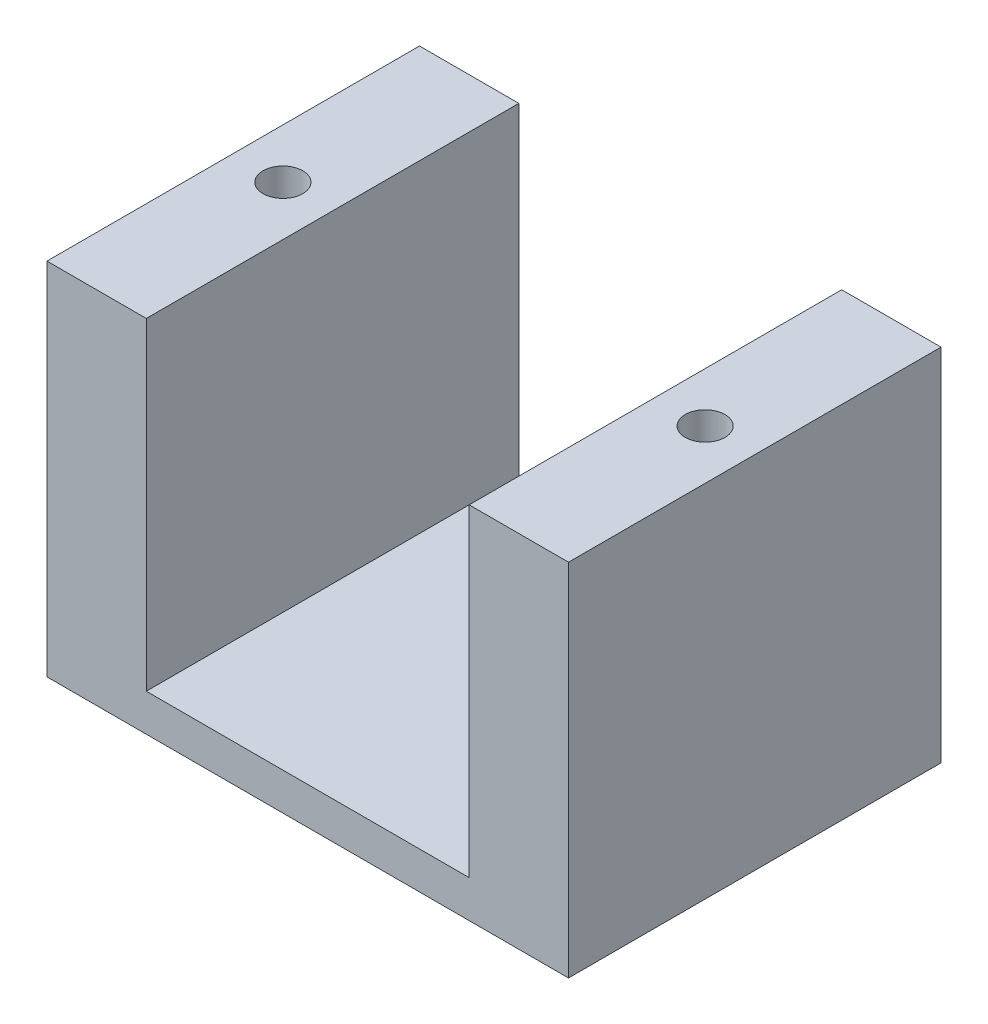
ISO-10303-21;
HEADER;
FILE_DESCRIPTION(('STEP AP214'),'2;1');
FILE_NAME('part.step','',(''),(''),'','','');
FILE_SCHEMA(('AUTOMOTIVE_DESIGN { 1 0 10303 214 1 1 1 1 }'));
ENDSEC;
DATA;
#1=APPLICATION_CONTEXT('core data for automotive mechanical design processes');
#2=APPLICATION_PROTOCOL_DEFINITION('international standard','automotive_design',2000,#1);
#3=PRODUCT_CONTEXT('',#1,'mechanical');
#4=PRODUCT('Part','Part','',(#3));
#5=PRODUCT_RELATED_PRODUCT_CATEGORY('part','',(#4));
#6=PRODUCT_DEFINITION_FORMATION('','',#4);
#7=PRODUCT_DEFINITION_CONTEXT('part definition',#1,'design');
#8=PRODUCT_DEFINITION('design','',#6,#7);
#9=PRODUCT_DEFINITION_SHAPE('','',#8);
#10=(LENGTH_UNIT() NAMED_UNIT(*) SI_UNIT(.MILLI.,.METRE.));
#11=(NAMED_UNIT(*) PLANE_ANGLE_UNIT() SI_UNIT($,.RADIAN.));
#12=(NAMED_UNIT(*) SI_UNIT($,.STERADIAN.) SOLID_ANGLE_UNIT());
#13=UNCERTAINTY_MEASURE_WITH_UNIT(LENGTH_MEASURE(1.E-05),#10,'distance_accuracy_value','');
#14=(GEOMETRIC_REPRESENTATION_CONTEXT(3) GLOBAL_UNCERTAINTY_ASSIGNED_CONTEXT((#13)) GLOBAL_UNIT_ASSIGNED_CONTEXT((#10,
#11,#12)) REPRESENTATION_CONTEXT('',''));
#15=CARTESIAN_POINT('',(0.,0.,0.));
#16=DIRECTION('',(0.,0.,1.));
#17=DIRECTION('',(1.,0.,0.));
#18=AXIS2_PLACEMENT_3D('',#15,#16,#17);
#19=CARTESIAN_POINT('',(-17.,-15.,15.));
#20=DIRECTION('',(0.,1.,0.));
#21=DIRECTION('',(0.,0.,1.));
#22=AXIS2_PLACEMENT_3D('',#19,#20,#21);
#23=CYLINDRICAL_SURFACE('',#22,1.59999999999999);
#24=CARTESIAN_POINT('',(-17.,29.,15.));
#25=DIRECTION('',(0.,-1.,0.));
#26=DIRECTION('',(0.,0.,-1.));
#27=AXIS2_PLACEMENT_3D('',#24,#25,#26);
#28=CIRCLE('',#27,1.59999999999999);
#29=CARTESIAN_POINT('',(-17.,29.,13.4));
#30=VERTEX_POINT('',#29);
#31=EDGE_CURVE('E167',#30,#30,#28,.F.);
#32=ORIENTED_EDGE('',*,*,#31,.T.);
#33=EDGE_LOOP('',(#32));
#34=FACE_BOUND('',#33,.T.);
#35=CARTESIAN_POINT('',(-17.,3.2,15.));
#36=DIRECTION('',(0.,-1.,0.));
#37=DIRECTION('',(0.,0.,-1.));
#38=AXIS2_PLACEMENT_3D('',#35,#36,#37);
#39=CIRCLE('',#38,1.59999999999999);
#40=CARTESIAN_POINT('',(-17.,3.2,13.4));
#41=VERTEX_POINT('',#40);
#42=EDGE_CURVE('E45',#41,#41,#39,.T.);
#43=ORIENTED_EDGE('',*,*,#42,.T.);
#44=EDGE_LOOP('',(#43));
#45=FACE_BOUND('',#44,.T.);
#46=ADVANCED_FACE('F41',(#34,#45),#23,.F.);
#47=CARTESIAN_POINT('',(-21.,0.,30.));
#48=DIRECTION('',(0.,1.,0.));
#49=DIRECTION('',(0.,0.,1.));
#50=AXIS2_PLACEMENT_3D('',#47,#48,#49);
#51=PLANE('',#50);
#52=CARTESIAN_POINT('',(-17.,0.,15.));
#53=DIRECTION('',(0.,-1.,0.));
#54=DIRECTION('',(0.,0.,-1.));
#55=AXIS2_PLACEMENT_3D('',#52,#53,#54);
#56=CIRCLE('',#55,2.9);
#57=CARTESIAN_POINT('',(-17.,0.,12.1));
#58=VERTEX_POINT('',#57);
#59=EDGE_CURVE('E178',#58,#58,#56,.T.);
#60=ORIENTED_EDGE('',*,*,#59,.F.);
#61=EDGE_LOOP('',(#60));
#62=FACE_BOUND('',#61,.T.);
#63=CARTESIAN_POINT('',(17.,0.,15.));
#64=DIRECTION('',(0.,-1.,0.));
#65=DIRECTION('',(0.,0.,1.));
#66=AXIS2_PLACEMENT_3D('',#63,#64,#65);
#67=CIRCLE('',#66,2.9);
#68=CARTESIAN_POINT('',(17.,0.,17.9));
#69=VERTEX_POINT('',#68);
#70=EDGE_CURVE('E183',#69,#69,#67,.T.);
#71=ORIENTED_EDGE('',*,*,#70,.F.);
#72=EDGE_LOOP('',(#71));
#73=FACE_BOUND('',#72,.T.);
#74=DIRECTION('',(1.,0.,0.));
#75=VECTOR('',#74,1.);
#76=CARTESIAN_POINT('',(-21.,0.,0.));
#77=LINE('',#76,#75);
#78=CARTESIAN_POINT('',(-21.,0.,0.));
#79=VERTEX_POINT('',#78);
#80=CARTESIAN_POINT('',(21.,0.,0.));
#81=VERTEX_POINT('',#80);
#82=EDGE_CURVE('E140',#79,#81,#77,.T.);
#83=ORIENTED_EDGE('',*,*,#82,.T.);
#84=DIRECTION('',(0.,0.,-1.));
#85=VECTOR('',#84,1.);
#86=CARTESIAN_POINT('',(21.,0.,30.));
#87=LINE('',#86,#85);
#88=CARTESIAN_POINT('',(21.,0.,30.));
#89=VERTEX_POINT('',#88);
#90=EDGE_CURVE('E11',#89,#81,#87,.T.);
#91=ORIENTED_EDGE('',*,*,#90,.F.);
#92=DIRECTION('',(1.,0.,0.));
#93=VECTOR('',#92,1.);
#94=CARTESIAN_POINT('',(-21.,0.,30.));
#95=LINE('',#94,#93);
#96=CARTESIAN_POINT('',(-21.,0.,30.));
#97=VERTEX_POINT('',#96);
#98=EDGE_CURVE('E155',#97,#89,#95,.T.);
#99=ORIENTED_EDGE('',*,*,#98,.F.);
#100=DIRECTION('',(0.,0.,-1.));
#101=VECTOR('',#100,1.);
#102=CARTESIAN_POINT('',(-21.,0.,30.));
#103=LINE('',#102,#101);
#104=EDGE_CURVE('E136',#97,#79,#103,.T.);
#105=ORIENTED_EDGE('',*,*,#104,.T.);
#106=EDGE_LOOP('',(#83,#91,#99,#105));
#107=FACE_BOUND('',#106,.T.);
#108=ADVANCED_FACE('F43',(#62,#73,#107),#51,.F.);
#109=CARTESIAN_POINT('',(21.,0.,30.));
#110=DIRECTION('',(-1.,0.,0.));
#111=DIRECTION('',(0.,-1.,0.));
#112=AXIS2_PLACEMENT_3D('',#109,#110,#111);
#113=PLANE('',#112);
#114=DIRECTION('',(0.,1.,0.));
#115=VECTOR('',#114,1.);
#116=CARTESIAN_POINT('',(21.,0.,0.));
#117=LINE('',#116,#115);
#118=CARTESIAN_POINT('',(21.,29.,0.));
#119=VERTEX_POINT('',#118);
#120=EDGE_CURVE('E143',#81,#119,#117,.T.);
#121=ORIENTED_EDGE('',*,*,#120,.T.);
#122=DIRECTION('',(0.,0.,-1.));
#123=VECTOR('',#122,1.);
#124=CARTESIAN_POINT('',(21.,29.,30.));
#125=LINE('',#124,#123);
#126=CARTESIAN_POINT('',(21.,29.,30.));
#127=VERTEX_POINT('',#126);
#128=EDGE_CURVE('E51',#127,#119,#125,.T.);
#129=ORIENTED_EDGE('',*,*,#128,.F.);
#130=DIRECTION('',(0.,1.,0.));
#131=VECTOR('',#130,1.);
#132=CARTESIAN_POINT('',(21.,0.,30.));
#133=LINE('',#132,#131);
#134=EDGE_CURVE('E103',#89,#127,#133,.T.);
#135=ORIENTED_EDGE('',*,*,#134,.F.);
#136=ORIENTED_EDGE('',*,*,#90,.T.);
#137=EDGE_LOOP('',(#121,#129,#135,#136));
#138=FACE_BOUND('',#137,.T.);
#139=ADVANCED_FACE('F230',(#138),#113,.F.);
#140=CARTESIAN_POINT('',(21.,29.,30.));
#141=DIRECTION('',(0.,-1.,0.));
#142=DIRECTION('',(1.,0.,0.));
#143=AXIS2_PLACEMENT_3D('',#140,#141,#142);
#144=PLANE('',#143);
#145=CARTESIAN_POINT('',(17.,29.,15.));
#146=DIRECTION('',(0.,-1.,0.));
#147=DIRECTION('',(1.,0.,0.));
#148=AXIS2_PLACEMENT_3D('',#145,#146,#147);
#149=CIRCLE('',#148,1.59999999999999);
#150=CARTESIAN_POINT('',(18.6,29.,15.));
#151=VERTEX_POINT('',#150);
#152=EDGE_CURVE('E144',#151,#151,#149,.F.);
#153=ORIENTED_EDGE('',*,*,#152,.F.);
#154=EDGE_LOOP('',(#153));
#155=FACE_BOUND('',#154,.T.);
#156=DIRECTION('',(-1.,0.,0.));
#157=VECTOR('',#156,1.);
#158=CARTESIAN_POINT('',(21.,29.,0.));
#159=LINE('',#158,#157);
#160=CARTESIAN_POINT('',(13.,29.,0.));
#161=VERTEX_POINT('',#160);
#162=EDGE_CURVE('E146',#119,#161,#159,.T.);
#163=ORIENTED_EDGE('',*,*,#162,.T.);
#164=DIRECTION('',(0.,0.,-1.));
#165=VECTOR('',#164,1.);
#166=CARTESIAN_POINT('',(13.,29.,30.));
#167=LINE('',#166,#165);
#168=CARTESIAN_POINT('',(13.,29.,30.));
#169=VERTEX_POINT('',#168);
#170=EDGE_CURVE('E162',#169,#161,#167,.T.);
#171=ORIENTED_EDGE('',*,*,#170,.F.);
#172=DIRECTION('',(-1.,0.,0.));
#173=VECTOR('',#172,1.);
#174=CARTESIAN_POINT('',(21.,29.,30.));
#175=LINE('',#174,#173);
#176=EDGE_CURVE('E193',#127,#169,#175,.T.);
#177=ORIENTED_EDGE('',*,*,#176,.F.);
#178=ORIENTED_EDGE('',*,*,#128,.T.);
#179=EDGE_LOOP('',(#163,#171,#177,#178));
#180=FACE_BOUND('',#179,.T.);
#181=ADVANCED_FACE('F354',(#155,#180),#144,.F.);
#182=CARTESIAN_POINT('',(13.,29.,30.));
#183=DIRECTION('',(1.,0.,0.));
#184=DIRECTION('',(0.,1.,0.));
#185=AXIS2_PLACEMENT_3D('',#182,#183,#184);
#186=PLANE('',#185);
#187=DIRECTION('',(0.,-1.,0.));
#188=VECTOR('',#187,1.);
#189=CARTESIAN_POINT('',(13.,29.,0.));
#190=LINE('',#189,#188);
#191=CARTESIAN_POINT('',(13.,3.,0.));
#192=VERTEX_POINT('',#191);
#193=EDGE_CURVE('E148',#161,#192,#190,.T.);
#194=ORIENTED_EDGE('',*,*,#193,.T.);
#195=DIRECTION('',(0.,0.,-1.));
#196=VECTOR('',#195,1.);
#197=CARTESIAN_POINT('',(13.,3.,30.));
#198=LINE('',#197,#196);
#199=CARTESIAN_POINT('',(13.,3.,30.));
#200=VERTEX_POINT('',#199);
#201=EDGE_CURVE('E159',#200,#192,#198,.T.);
#202=ORIENTED_EDGE('',*,*,#201,.F.);
#203=DIRECTION('',(0.,-1.,0.));
#204=VECTOR('',#203,1.);
#205=CARTESIAN_POINT('',(13.,29.,30.));
#206=LINE('',#205,#204);
#207=EDGE_CURVE('E195',#169,#200,#206,.T.);
#208=ORIENTED_EDGE('',*,*,#207,.F.);
#209=ORIENTED_EDGE('',*,*,#170,.T.);
#210=EDGE_LOOP('',(#194,#202,#208,#209));
#211=FACE_BOUND('',#210,.T.);
#212=ADVANCED_FACE('F201',(#211),#186,.F.);
#213=CARTESIAN_POINT('',(-13.,3.,30.));
#214=DIRECTION('',(0.,-1.,0.));
#215=DIRECTION('',(0.,0.,-1.));
#216=AXIS2_PLACEMENT_3D('',#213,#214,#215);
#217=PLANE('',#216);
#218=DIRECTION('',(-1.,0.,0.));
#219=VECTOR('',#218,1.);
#220=CARTESIAN_POINT('',(-13.,3.,0.));
#221=LINE('',#220,#219);
#222=CARTESIAN_POINT('',(-13.,3.,0.));
#223=VERTEX_POINT('',#222);
#224=EDGE_CURVE('E150',#192,#223,#221,.T.);
#225=ORIENTED_EDGE('',*,*,#224,.T.);
#226=DIRECTION('',(0.,0.,-1.));
#227=VECTOR('',#226,1.);
#228=CARTESIAN_POINT('',(-13.,3.,30.));
#229=LINE('',#228,#227);
#230=CARTESIAN_POINT('',(-13.,3.,30.));
#231=VERTEX_POINT('',#230);
#232=EDGE_CURVE('E131',#231,#223,#229,.T.);
#233=ORIENTED_EDGE('',*,*,#232,.F.);
#234=DIRECTION('',(-1.,0.,0.));
#235=VECTOR('',#234,1.);
#236=CARTESIAN_POINT('',(-13.,3.,30.));
#237=LINE('',#236,#235);
#238=EDGE_CURVE('E122',#200,#231,#237,.T.);
#239=ORIENTED_EDGE('',*,*,#238,.F.);
#240=ORIENTED_EDGE('',*,*,#201,.T.);
#241=EDGE_LOOP('',(#225,#233,#239,#240));
#242=FACE_BOUND('',#241,.T.);
#243=ADVANCED_FACE('F205',(#242),#217,.F.);
#244=CARTESIAN_POINT('',(-13.,29.,30.));
#245=DIRECTION('',(-1.,0.,0.));
#246=DIRECTION('',(0.,-1.,0.));
#247=AXIS2_PLACEMENT_3D('',#244,#245,#246);
#248=PLANE('',#247);
#249=DIRECTION('',(0.,1.,0.));
#250=VECTOR('',#249,1.);
#251=CARTESIAN_POINT('',(-13.,29.,0.));
#252=LINE('',#251,#250);
#253=CARTESIAN_POINT('',(-13.,29.,0.));
#254=VERTEX_POINT('',#253);
#255=EDGE_CURVE('E130',#223,#254,#252,.T.);
#256=ORIENTED_EDGE('',*,*,#255,.T.);
#257=DIRECTION('',(0.,0.,-1.));
#258=VECTOR('',#257,1.);
#259=CARTESIAN_POINT('',(-13.,29.,30.));
#260=LINE('',#259,#258);
#261=CARTESIAN_POINT('',(-13.,29.,30.));
#262=VERTEX_POINT('',#261);
#263=EDGE_CURVE('E127',#262,#254,#260,.T.);
#264=ORIENTED_EDGE('',*,*,#263,.F.);
#265=DIRECTION('',(0.,1.,0.));
#266=VECTOR('',#265,1.);
#267=CARTESIAN_POINT('',(-13.,29.,30.));
#268=LINE('',#267,#266);
#269=EDGE_CURVE('E116',#231,#262,#268,.T.);
#270=ORIENTED_EDGE('',*,*,#269,.F.);
#271=ORIENTED_EDGE('',*,*,#232,.T.);
#272=EDGE_LOOP('',(#256,#264,#270,#271));
#273=FACE_BOUND('',#272,.T.);
#274=ADVANCED_FACE('F128',(#273),#248,.F.);
#275=CARTESIAN_POINT('',(-21.,29.,30.));
#276=DIRECTION('',(0.,-1.,0.));
#277=DIRECTION('',(0.,0.,-1.));
#278=AXIS2_PLACEMENT_3D('',#275,#276,#277);
#279=PLANE('',#278);
#280=ORIENTED_EDGE('',*,*,#31,.F.);
#281=EDGE_LOOP('',(#280));
#282=FACE_BOUND('',#281,.T.);
#283=DIRECTION('',(-1.,0.,0.));
#284=VECTOR('',#283,1.);
#285=CARTESIAN_POINT('',(-21.,29.,0.));
#286=LINE('',#285,#284);
#287=CARTESIAN_POINT('',(-21.,29.,0.));
#288=VERTEX_POINT('',#287);
#289=EDGE_CURVE('E89',#254,#288,#286,.T.);
#290=ORIENTED_EDGE('',*,*,#289,.T.);
#291=DIRECTION('',(0.,0.,-1.));
#292=VECTOR('',#291,1.);
#293=CARTESIAN_POINT('',(-21.,29.,30.));
#294=LINE('',#293,#292);
#295=CARTESIAN_POINT('',(-21.,29.,30.));
#296=VERTEX_POINT('',#295);
#297=EDGE_CURVE('E132',#296,#288,#294,.T.);
#298=ORIENTED_EDGE('',*,*,#297,.F.);
#299=DIRECTION('',(-1.,0.,0.));
#300=VECTOR('',#299,1.);
#301=CARTESIAN_POINT('',(-21.,29.,30.));
#302=LINE('',#301,#300);
#303=EDGE_CURVE('E120',#262,#296,#302,.T.);
#304=ORIENTED_EDGE('',*,*,#303,.F.);
#305=ORIENTED_EDGE('',*,*,#263,.T.);
#306=EDGE_LOOP('',(#290,#298,#304,#305));
#307=FACE_BOUND('',#306,.T.);
#308=ADVANCED_FACE('F134',(#282,#307),#279,.F.);
#309=CARTESIAN_POINT('',(-21.,0.,30.));
#310=DIRECTION('',(1.,0.,0.));
#311=DIRECTION('',(0.,0.,-1.));
#312=AXIS2_PLACEMENT_3D('',#309,#310,#311);
#313=PLANE('',#312);
#314=DIRECTION('',(0.,-1.,0.));
#315=VECTOR('',#314,1.);
#316=CARTESIAN_POINT('',(-21.,0.,0.));
#317=LINE('',#316,#315);
#318=EDGE_CURVE('E95',#288,#79,#317,.T.);
#319=ORIENTED_EDGE('',*,*,#318,.T.);
#320=ORIENTED_EDGE('',*,*,#104,.F.);
#321=DIRECTION('',(0.,-1.,0.));
#322=VECTOR('',#321,1.);
#323=CARTESIAN_POINT('',(-21.,0.,30.));
#324=LINE('',#323,#322);
#325=EDGE_CURVE('E60',#296,#97,#324,.T.);
#326=ORIENTED_EDGE('',*,*,#325,.F.);
#327=ORIENTED_EDGE('',*,*,#297,.T.);
#328=EDGE_LOOP('',(#319,#320,#326,#327));
#329=FACE_BOUND('',#328,.T.);
#330=ADVANCED_FACE('F213',(#329),#313,.F.);
#331=CARTESIAN_POINT('',(0.,0.,30.));
#332=DIRECTION('',(0.,0.,1.));
#333=DIRECTION('',(1.,0.,0.));
#334=AXIS2_PLACEMENT_3D('',#331,#332,#333);
#335=PLANE('',#334);
#336=ORIENTED_EDGE('',*,*,#98,.T.);
#337=ORIENTED_EDGE('',*,*,#134,.T.);
#338=ORIENTED_EDGE('',*,*,#176,.T.);
#339=ORIENTED_EDGE('',*,*,#207,.T.);
#340=ORIENTED_EDGE('',*,*,#238,.T.);
#341=ORIENTED_EDGE('',*,*,#269,.T.);
#342=ORIENTED_EDGE('',*,*,#303,.T.);
#343=ORIENTED_EDGE('',*,*,#325,.T.);
#344=EDGE_LOOP('',(#336,#337,#338,#339,#340,#341,#342,#343));
#345=FACE_BOUND('',#344,.T.);
#346=ADVANCED_FACE('F118',(#345),#335,.T.);
#347=CARTESIAN_POINT('',(0.,0.,0.));
#348=DIRECTION('',(0.,0.,1.));
#349=DIRECTION('',(1.,0.,0.));
#350=AXIS2_PLACEMENT_3D('',#347,#348,#349);
#351=PLANE('',#350);
#352=ORIENTED_EDGE('',*,*,#82,.F.);
#353=ORIENTED_EDGE('',*,*,#318,.F.);
#354=ORIENTED_EDGE('',*,*,#289,.F.);
#355=ORIENTED_EDGE('',*,*,#255,.F.);
#356=ORIENTED_EDGE('',*,*,#224,.F.);
#357=ORIENTED_EDGE('',*,*,#193,.F.);
#358=ORIENTED_EDGE('',*,*,#162,.F.);
#359=ORIENTED_EDGE('',*,*,#120,.F.);
#360=EDGE_LOOP('',(#352,#353,#354,#355,#356,#357,#358,#359));
#361=FACE_BOUND('',#360,.T.);
#362=ADVANCED_FACE('F208',(#361),#351,.F.);
#363=CARTESIAN_POINT('',(17.,-15.,15.));
#364=DIRECTION('',(0.,1.,0.));
#365=DIRECTION('',(0.,0.,1.));
#366=AXIS2_PLACEMENT_3D('',#363,#364,#365);
#367=CYLINDRICAL_SURFACE('',#366,1.59999999999999);
#368=CARTESIAN_POINT('',(17.,3.2,15.));
#369=DIRECTION('',(0.,1.,0.));
#370=DIRECTION('',(0.,0.,1.));
#371=AXIS2_PLACEMENT_3D('',#368,#369,#370);
#372=CIRCLE('',#371,1.59999999999999);
#373=CARTESIAN_POINT('',(17.,3.2,16.6));
#374=VERTEX_POINT('',#373);
#375=EDGE_CURVE('E171',#374,#374,#372,.T.);
#376=ORIENTED_EDGE('',*,*,#375,.F.);
#377=EDGE_LOOP('',(#376));
#378=FACE_BOUND('',#377,.T.);
#379=ORIENTED_EDGE('',*,*,#152,.T.);
#380=EDGE_LOOP('',(#379));
#381=FACE_BOUND('',#380,.T.);
#382=ADVANCED_FACE('F237',(#378,#381),#367,.F.);
#383=CARTESIAN_POINT('',(17.,3.2,15.));
#384=DIRECTION('',(0.,-1.,0.));
#385=DIRECTION('',(0.,0.,-1.));
#386=AXIS2_PLACEMENT_3D('',#383,#384,#385);
#387=CYLINDRICAL_SURFACE('',#386,2.9);
#388=CARTESIAN_POINT('',(17.,3.2,15.));
#389=DIRECTION('',(0.,-1.,0.));
#390=DIRECTION('',(0.,0.,1.));
#391=AXIS2_PLACEMENT_3D('',#388,#389,#390);
#392=CIRCLE('',#391,2.9);
#393=CARTESIAN_POINT('',(17.,3.2,17.9));
#394=VERTEX_POINT('',#393);
#395=EDGE_CURVE('E188',#394,#394,#392,.T.);
#396=ORIENTED_EDGE('',*,*,#395,.F.);
#397=EDGE_LOOP('',(#396));
#398=FACE_BOUND('',#397,.T.);
#399=ORIENTED_EDGE('',*,*,#70,.T.);
#400=EDGE_LOOP('',(#399));
#401=FACE_BOUND('',#400,.T.);
#402=ADVANCED_FACE('F239',(#398,#401),#387,.F.);
#403=CARTESIAN_POINT('',(17.,3.2,15.));
#404=DIRECTION('',(0.,1.,0.));
#405=DIRECTION('',(0.,0.,1.));
#406=AXIS2_PLACEMENT_3D('',#403,#404,#405);
#407=PLANE('',#406);
#408=ORIENTED_EDGE('',*,*,#375,.T.);
#409=EDGE_LOOP('',(#408));
#410=FACE_BOUND('',#409,.T.);
#411=ORIENTED_EDGE('',*,*,#395,.T.);
#412=EDGE_LOOP('',(#411));
#413=FACE_BOUND('',#412,.T.);
#414=ADVANCED_FACE('F235',(#410,#413),#407,.F.);
#415=CARTESIAN_POINT('',(-17.,3.2,15.));
#416=DIRECTION('',(0.,-1.,0.));
#417=DIRECTION('',(0.,0.,-1.));
#418=AXIS2_PLACEMENT_3D('',#415,#416,#417);
#419=CYLINDRICAL_SURFACE('',#418,2.9);
#420=CARTESIAN_POINT('',(-17.,3.2,15.));
#421=DIRECTION('',(0.,-1.,0.));
#422=DIRECTION('',(0.,0.,-1.));
#423=AXIS2_PLACEMENT_3D('',#420,#421,#422);
#424=CIRCLE('',#423,2.9);
#425=CARTESIAN_POINT('',(-17.,3.2,12.1));
#426=VERTEX_POINT('',#425);
#427=EDGE_CURVE('E173',#426,#426,#424,.T.);
#428=ORIENTED_EDGE('',*,*,#427,.F.);
#429=EDGE_LOOP('',(#428));
#430=FACE_BOUND('',#429,.T.);
#431=ORIENTED_EDGE('',*,*,#59,.T.);
#432=EDGE_LOOP('',(#431));
#433=FACE_BOUND('',#432,.T.);
#434=ADVANCED_FACE('F264',(#430,#433),#419,.F.);
#435=CARTESIAN_POINT('',(-17.,3.2,15.));
#436=DIRECTION('',(0.,-1.,0.));
#437=DIRECTION('',(0.,0.,-1.));
#438=AXIS2_PLACEMENT_3D('',#435,#436,#437);
#439=PLANE('',#438);
#440=ORIENTED_EDGE('',*,*,#42,.F.);
#441=EDGE_LOOP('',(#440));
#442=FACE_BOUND('',#441,.T.);
#443=ORIENTED_EDGE('',*,*,#427,.T.);
#444=EDGE_LOOP('',(#443));
#445=FACE_BOUND('',#444,.T.);
#446=ADVANCED_FACE('F270',(#442,#445),#439,.T.);
#447=CLOSED_SHELL('',(#46,#108,#139,#181,#212,#243,#274,#308,#330,#346,#362,#382,#402,#414,#434,#446));
#448=MANIFOLD_SOLID_BREP('B2',#447);
#449=ADVANCED_BREP_SHAPE_REPRESENTATION('',(#18,#448),#14);
#450=SHAPE_DEFINITION_REPRESENTATION(#9,#449);
ENDSEC;
END-ISO-10303-21;
